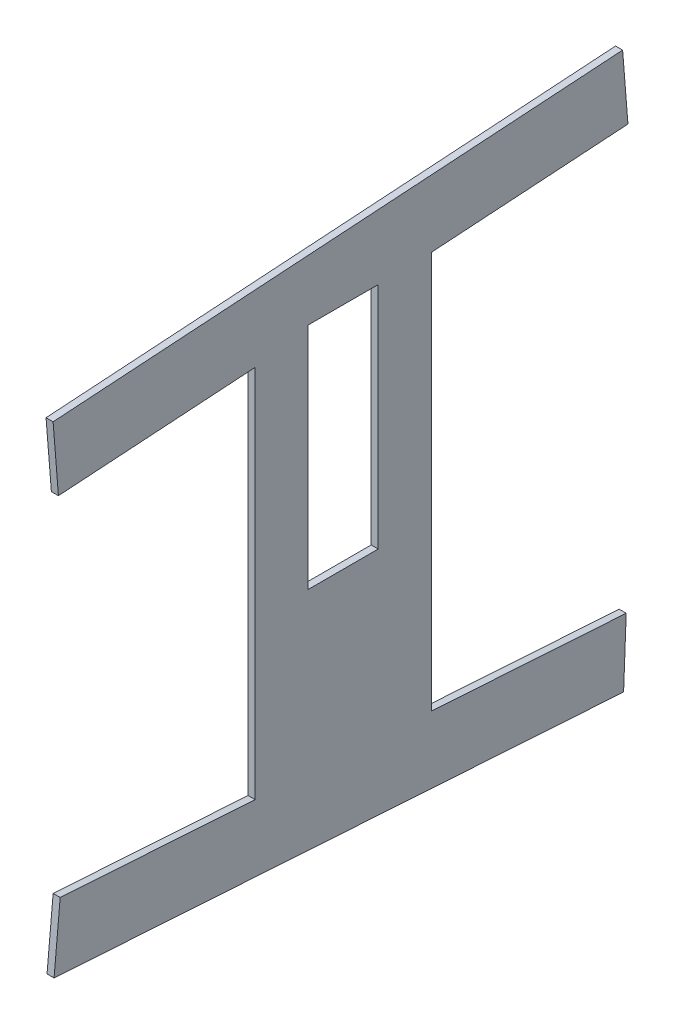
ISO-10303-21;
HEADER;
FILE_DESCRIPTION(('STEP AP214'),'2;1');
FILE_NAME('part.step','',(''),(''),'','','');
FILE_SCHEMA(('AUTOMOTIVE_DESIGN { 1 0 10303 214 1 1 1 1 }'));
ENDSEC;
DATA;
#1=APPLICATION_CONTEXT('core data for automotive mechanical design processes');
#2=APPLICATION_PROTOCOL_DEFINITION('international standard','automotive_design',2000,#1);
#3=PRODUCT_CONTEXT('',#1,'mechanical');
#4=PRODUCT('Part','Part','',(#3));
#5=PRODUCT_RELATED_PRODUCT_CATEGORY('part','',(#4));
#6=PRODUCT_DEFINITION_FORMATION('','',#4);
#7=PRODUCT_DEFINITION_CONTEXT('part definition',#1,'design');
#8=PRODUCT_DEFINITION('design','',#6,#7);
#9=PRODUCT_DEFINITION_SHAPE('','',#8);
#10=(LENGTH_UNIT() NAMED_UNIT(*) SI_UNIT(.MILLI.,.METRE.));
#11=(NAMED_UNIT(*) PLANE_ANGLE_UNIT() SI_UNIT($,.RADIAN.));
#12=(NAMED_UNIT(*) SI_UNIT($,.STERADIAN.) SOLID_ANGLE_UNIT());
#13=UNCERTAINTY_MEASURE_WITH_UNIT(LENGTH_MEASURE(1.E-05),#10,'distance_accuracy_value','');
#14=(GEOMETRIC_REPRESENTATION_CONTEXT(3) GLOBAL_UNCERTAINTY_ASSIGNED_CONTEXT((#13)) GLOBAL_UNIT_ASSIGNED_CONTEXT((#10,
#11,#12)) REPRESENTATION_CONTEXT('',''));
#15=CARTESIAN_POINT('',(0.,0.,0.));
#16=DIRECTION('',(0.,0.,1.));
#17=DIRECTION('',(1.,0.,0.));
#18=AXIS2_PLACEMENT_3D('',#15,#16,#17);
#19=CARTESIAN_POINT('',(2.,-49.5204372760135,78.8174325640613));
#20=DIRECTION('',(0.,-0.997886860933081,0.0649754782754394));
#21=DIRECTION('',(0.,-0.0649754782754394,-0.997886860933081));
#22=AXIS2_PLACEMENT_3D('',#19,#20,#21);
#23=PLANE('',#22);
#24=DIRECTION('',(0.,0.0649754782754394,0.997886860933081));
#25=VECTOR('',#24,1.);
#26=CARTESIAN_POINT('',(0.,-49.5204372760135,78.8174325640613));
#27=LINE('',#26,#25);
#28=CARTESIAN_POINT('',(0.,-53.1231711456616,23.4870081119276));
#29=VERTEX_POINT('',#28);
#30=CARTESIAN_POINT('',(0.,-49.5204372760135,78.8174325640613));
#31=VERTEX_POINT('',#30);
#32=EDGE_CURVE('E195',#29,#31,#27,.T.);
#33=ORIENTED_EDGE('',*,*,#32,.T.);
#34=DIRECTION('',(-1.,0.,0.));
#35=VECTOR('',#34,1.);
#36=CARTESIAN_POINT('',(2.,-49.5204372760135,78.8174325640613));
#37=LINE('',#36,#35);
#38=CARTESIAN_POINT('',(2.,-49.5204372760135,78.8174325640613));
#39=VERTEX_POINT('',#38);
#40=EDGE_CURVE('E11',#39,#31,#37,.T.);
#41=ORIENTED_EDGE('',*,*,#40,.F.);
#42=DIRECTION('',(0.,0.0649754782754394,0.997886860933081));
#43=VECTOR('',#42,1.);
#44=CARTESIAN_POINT('',(2.,-49.5204372760135,78.8174325640613));
#45=LINE('',#44,#43);
#46=CARTESIAN_POINT('',(2.,-53.1231711456616,23.4870081119276));
#47=VERTEX_POINT('',#46);
#48=EDGE_CURVE('E201',#47,#39,#45,.T.);
#49=ORIENTED_EDGE('',*,*,#48,.F.);
#50=DIRECTION('',(-1.,0.,0.));
#51=VECTOR('',#50,1.);
#52=CARTESIAN_POINT('',(2.,-53.1231711456616,23.4870081119276));
#53=LINE('',#52,#51);
#54=EDGE_CURVE('E239',#47,#29,#53,.T.);
#55=ORIENTED_EDGE('',*,*,#54,.T.);
#56=EDGE_LOOP('',(#33,#41,#49,#55));
#57=FACE_BOUND('',#56,.T.);
#58=ADVANCED_FACE('F39',(#57),#23,.F.);
#59=CARTESIAN_POINT('',(2.,-68.4478345443312,80.5503779347406));
#60=DIRECTION('',(0.,-0.0911761531463019,-0.99583478001998));
#61=DIRECTION('',(0.,0.99583478001998,-0.0911761531463019));
#62=AXIS2_PLACEMENT_3D('',#59,#60,#61);
#63=PLANE('',#62);
#64=DIRECTION('',(0.,-0.99583478001998,0.0911761531463019));
#65=VECTOR('',#64,1.);
#66=CARTESIAN_POINT('',(0.,-68.4478345443312,80.5503779347406));
#67=LINE('',#66,#65);
#68=CARTESIAN_POINT('',(0.,-68.4478345443312,80.5503779347406));
#69=VERTEX_POINT('',#68);
#70=EDGE_CURVE('E243',#31,#69,#67,.T.);
#71=ORIENTED_EDGE('',*,*,#70,.T.);
#72=DIRECTION('',(-1.,0.,0.));
#73=VECTOR('',#72,1.);
#74=CARTESIAN_POINT('',(2.,-68.4478345443312,80.5503779347406));
#75=LINE('',#74,#73);
#76=CARTESIAN_POINT('',(2.,-68.4478345443312,80.5503779347406));
#77=VERTEX_POINT('',#76);
#78=EDGE_CURVE('E47',#77,#69,#75,.T.);
#79=ORIENTED_EDGE('',*,*,#78,.F.);
#80=DIRECTION('',(0.,-0.99583478001998,0.0911761531463019));
#81=VECTOR('',#80,1.);
#82=CARTESIAN_POINT('',(2.,-68.4478345443312,80.5503779347406));
#83=LINE('',#82,#81);
#84=EDGE_CURVE('E205',#39,#77,#83,.T.);
#85=ORIENTED_EDGE('',*,*,#84,.F.);
#86=ORIENTED_EDGE('',*,*,#40,.T.);
#87=EDGE_LOOP('',(#71,#79,#85,#86));
#88=FACE_BOUND('',#87,.T.);
#89=ADVANCED_FACE('F340',(#88),#63,.F.);
#90=CARTESIAN_POINT('',(2.,-78.9738620249524,-81.1072935364186));
#91=DIRECTION('',(0.,0.997886860933081,-0.0649754782754395));
#92=DIRECTION('',(0.,0.0649754782754395,0.997886860933081));
#93=AXIS2_PLACEMENT_3D('',#90,#91,#92);
#94=PLANE('',#93);
#95=DIRECTION('',(0.,-0.0649754782754395,-0.997886860933081));
#96=VECTOR('',#95,1.);
#97=CARTESIAN_POINT('',(0.,-78.9738620249524,-81.1072935364186));
#98=LINE('',#97,#96);
#99=CARTESIAN_POINT('',(0.,-78.9738620249524,-81.1072935364186));
#100=VERTEX_POINT('',#99);
#101=EDGE_CURVE('E246',#69,#100,#98,.T.);
#102=ORIENTED_EDGE('',*,*,#101,.T.);
#103=DIRECTION('',(-1.,0.,0.));
#104=VECTOR('',#103,1.);
#105=CARTESIAN_POINT('',(2.,-78.9738620249524,-81.1072935364186));
#106=LINE('',#105,#104);
#107=CARTESIAN_POINT('',(2.,-78.9738620249524,-81.1072935364186));
#108=VERTEX_POINT('',#107);
#109=EDGE_CURVE('E310',#108,#100,#106,.T.);
#110=ORIENTED_EDGE('',*,*,#109,.F.);
#111=DIRECTION('',(0.,-0.0649754782754395,-0.997886860933081));
#112=VECTOR('',#111,1.);
#113=CARTESIAN_POINT('',(2.,-78.9738620249524,-81.1072935364186));
#114=LINE('',#113,#112);
#115=EDGE_CURVE('E209',#77,#108,#114,.T.);
#116=ORIENTED_EDGE('',*,*,#115,.F.);
#117=ORIENTED_EDGE('',*,*,#78,.T.);
#118=EDGE_LOOP('',(#102,#110,#116,#117));
#119=FACE_BOUND('',#118,.T.);
#120=ADVANCED_FACE('F319',(#119),#94,.F.);
#121=CARTESIAN_POINT('',(2.,-59.981558577813,-81.8434163402061));
#122=DIRECTION('',(0.,0.0387299257254191,0.999249714962833));
#123=DIRECTION('',(0.,-0.999249714962833,0.0387299257254191));
#124=AXIS2_PLACEMENT_3D('',#121,#122,#123);
#125=PLANE('',#124);
#126=DIRECTION('',(0.,0.999249714962833,-0.0387299257254191));
#127=VECTOR('',#126,1.);
#128=CARTESIAN_POINT('',(0.,-59.981558577813,-81.8434163402061));
#129=LINE('',#128,#127);
#130=CARTESIAN_POINT('',(0.,-59.981558577813,-81.8434163402061));
#131=VERTEX_POINT('',#130);
#132=EDGE_CURVE('E249',#100,#131,#129,.T.);
#133=ORIENTED_EDGE('',*,*,#132,.T.);
#134=DIRECTION('',(-1.,0.,0.));
#135=VECTOR('',#134,1.);
#136=CARTESIAN_POINT('',(2.,-59.981558577813,-81.8434163402061));
#137=LINE('',#136,#135);
#138=CARTESIAN_POINT('',(2.,-59.981558577813,-81.8434163402061));
#139=VERTEX_POINT('',#138);
#140=EDGE_CURVE('E306',#139,#131,#137,.T.);
#141=ORIENTED_EDGE('',*,*,#140,.F.);
#142=DIRECTION('',(0.,0.999249714962833,-0.0387299257254191));
#143=VECTOR('',#142,1.);
#144=CARTESIAN_POINT('',(2.,-59.981558577813,-81.8434163402061));
#145=LINE('',#144,#143);
#146=EDGE_CURVE('E212',#108,#139,#145,.T.);
#147=ORIENTED_EDGE('',*,*,#146,.F.);
#148=ORIENTED_EDGE('',*,*,#109,.T.);
#149=EDGE_LOOP('',(#133,#141,#147,#148));
#150=FACE_BOUND('',#149,.T.);
#151=ADVANCED_FACE('F328',(#150),#125,.F.);
#152=CARTESIAN_POINT('',(2.,-56.3788247081649,-26.5129918880724));
#153=DIRECTION('',(0.,-0.997886860933081,0.0649754782754394));
#154=DIRECTION('',(0.,-0.0649754782754394,-0.997886860933081));
#155=AXIS2_PLACEMENT_3D('',#152,#153,#154);
#156=PLANE('',#155);
#157=DIRECTION('',(0.,0.0649754782754394,0.997886860933081));
#158=VECTOR('',#157,1.);
#159=CARTESIAN_POINT('',(0.,-56.3788247081649,-26.5129918880724));
#160=LINE('',#159,#158);
#161=CARTESIAN_POINT('',(0.,-56.3788247081649,-26.5129918880724));
#162=VERTEX_POINT('',#161);
#163=EDGE_CURVE('E252',#131,#162,#160,.T.);
#164=ORIENTED_EDGE('',*,*,#163,.T.);
#165=DIRECTION('',(-1.,0.,0.));
#166=VECTOR('',#165,1.);
#167=CARTESIAN_POINT('',(2.,-56.3788247081649,-26.5129918880724));
#168=LINE('',#167,#166);
#169=CARTESIAN_POINT('',(2.,-56.3788247081649,-26.5129918880724));
#170=VERTEX_POINT('',#169);
#171=EDGE_CURVE('E302',#170,#162,#168,.T.);
#172=ORIENTED_EDGE('',*,*,#171,.F.);
#173=DIRECTION('',(0.,0.0649754782754394,0.997886860933081));
#174=VECTOR('',#173,1.);
#175=CARTESIAN_POINT('',(2.,-56.3788247081649,-26.5129918880724));
#176=LINE('',#175,#174);
#177=EDGE_CURVE('E215',#139,#170,#176,.T.);
#178=ORIENTED_EDGE('',*,*,#177,.F.);
#179=ORIENTED_EDGE('',*,*,#140,.T.);
#180=EDGE_LOOP('',(#164,#172,#178,#179));
#181=FACE_BOUND('',#180,.T.);
#182=ADVANCED_FACE('F332',(#181),#156,.F.);
#183=CARTESIAN_POINT('',(2.,56.3788247081649,-26.5129918880724));
#184=DIRECTION('',(0.,0.,1.));
#185=DIRECTION('',(1.,0.,0.));
#186=AXIS2_PLACEMENT_3D('',#183,#184,#185);
#187=PLANE('',#186);
#188=DIRECTION('',(0.,1.,0.));
#189=VECTOR('',#188,1.);
#190=CARTESIAN_POINT('',(0.,56.3788247081649,-26.5129918880724));
#191=LINE('',#190,#189);
#192=CARTESIAN_POINT('',(0.,56.3788247081649,-26.5129918880724));
#193=VERTEX_POINT('',#192);
#194=EDGE_CURVE('E255',#162,#193,#191,.T.);
#195=ORIENTED_EDGE('',*,*,#194,.T.);
#196=DIRECTION('',(-1.,0.,0.));
#197=VECTOR('',#196,1.);
#198=CARTESIAN_POINT('',(2.,56.3788247081649,-26.5129918880724));
#199=LINE('',#198,#197);
#200=CARTESIAN_POINT('',(2.,56.3788247081649,-26.5129918880724));
#201=VERTEX_POINT('',#200);
#202=EDGE_CURVE('E298',#201,#193,#199,.T.);
#203=ORIENTED_EDGE('',*,*,#202,.F.);
#204=DIRECTION('',(0.,1.,0.));
#205=VECTOR('',#204,1.);
#206=CARTESIAN_POINT('',(2.,56.3788247081649,-26.5129918880724));
#207=LINE('',#206,#205);
#208=EDGE_CURVE('E218',#170,#201,#207,.T.);
#209=ORIENTED_EDGE('',*,*,#208,.F.);
#210=ORIENTED_EDGE('',*,*,#171,.T.);
#211=EDGE_LOOP('',(#195,#203,#209,#210));
#212=FACE_BOUND('',#211,.T.);
#213=ADVANCED_FACE('F373',(#212),#187,.F.);
#214=CARTESIAN_POINT('',(2.,60.018441422187,-82.3414089760381));
#215=DIRECTION('',(0.,0.997881692444022,0.0650548067790153));
#216=DIRECTION('',(0.,-0.0650548067790154,0.997881692444022));
#217=AXIS2_PLACEMENT_3D('',#214,#215,#216);
#218=PLANE('',#217);
#219=DIRECTION('',(0.,0.0650548067790154,-0.997881692444022));
#220=VECTOR('',#219,1.);
#221=CARTESIAN_POINT('',(0.,60.018441422187,-82.3414089760381));
#222=LINE('',#221,#220);
#223=CARTESIAN_POINT('',(0.,60.018441422187,-82.3414089760381));
#224=VERTEX_POINT('',#223);
#225=EDGE_CURVE('E258',#193,#224,#222,.T.);
#226=ORIENTED_EDGE('',*,*,#225,.T.);
#227=DIRECTION('',(-1.,0.,0.));
#228=VECTOR('',#227,1.);
#229=CARTESIAN_POINT('',(2.,60.018441422187,-82.3414089760381));
#230=LINE('',#229,#228);
#231=CARTESIAN_POINT('',(2.,60.018441422187,-82.3414089760381));
#232=VERTEX_POINT('',#231);
#233=EDGE_CURVE('E294',#232,#224,#230,.T.);
#234=ORIENTED_EDGE('',*,*,#233,.F.);
#235=DIRECTION('',(0.,0.0650548067790154,-0.997881692444022));
#236=VECTOR('',#235,1.);
#237=CARTESIAN_POINT('',(2.,60.018441422187,-82.3414089760381));
#238=LINE('',#237,#236);
#239=EDGE_CURVE('E221',#201,#232,#238,.T.);
#240=ORIENTED_EDGE('',*,*,#239,.F.);
#241=ORIENTED_EDGE('',*,*,#202,.T.);
#242=EDGE_LOOP('',(#226,#234,#240,#241));
#243=FACE_BOUND('',#242,.T.);
#244=ADVANCED_FACE('F371',(#243),#218,.F.);
#245=CARTESIAN_POINT('',(2.,78.9601383670115,-80.8284170879658));
#246=DIRECTION('',(0.,-0.0796226577997323,0.996825076111605));
#247=DIRECTION('',(0.,-0.996825076111605,-0.0796226577997323));
#248=AXIS2_PLACEMENT_3D('',#245,#246,#247);
#249=PLANE('',#248);
#250=DIRECTION('',(0.,0.996825076111605,0.0796226577997323));
#251=VECTOR('',#250,1.);
#252=CARTESIAN_POINT('',(0.,78.9601383670115,-80.8284170879658));
#253=LINE('',#252,#251);
#254=CARTESIAN_POINT('',(0.,78.9601383670115,-80.8284170879658));
#255=VERTEX_POINT('',#254);
#256=EDGE_CURVE('E261',#224,#255,#253,.T.);
#257=ORIENTED_EDGE('',*,*,#256,.T.);
#258=DIRECTION('',(-1.,0.,0.));
#259=VECTOR('',#258,1.);
#260=CARTESIAN_POINT('',(2.,78.9601383670115,-80.8284170879658));
#261=LINE('',#260,#259);
#262=CARTESIAN_POINT('',(2.,78.9601383670115,-80.8284170879658));
#263=VERTEX_POINT('',#262);
#264=EDGE_CURVE('E290',#263,#255,#261,.T.);
#265=ORIENTED_EDGE('',*,*,#264,.F.);
#266=DIRECTION('',(0.,0.996825076111605,0.0796226577997323));
#267=VECTOR('',#266,1.);
#268=CARTESIAN_POINT('',(2.,78.9601383670115,-80.8284170879658));
#269=LINE('',#268,#267);
#270=EDGE_CURVE('E224',#232,#263,#269,.T.);
#271=ORIENTED_EDGE('',*,*,#270,.F.);
#272=ORIENTED_EDGE('',*,*,#233,.T.);
#273=EDGE_LOOP('',(#257,#265,#271,#272));
#274=FACE_BOUND('',#273,.T.);
#275=ADVANCED_FACE('F367',(#274),#249,.F.);
#276=CARTESIAN_POINT('',(2.,68.421259668811,80.8284170879658));
#277=DIRECTION('',(0.,-0.997881692444022,-0.0650548067790154));
#278=DIRECTION('',(0.,0.0650548067790154,-0.997881692444022));
#279=AXIS2_PLACEMENT_3D('',#276,#277,#278);
#280=PLANE('',#279);
#281=DIRECTION('',(0.,-0.0650548067790154,0.997881692444022));
#282=VECTOR('',#281,1.);
#283=CARTESIAN_POINT('',(0.,68.421259668811,80.8284170879658));
#284=LINE('',#283,#282);
#285=CARTESIAN_POINT('',(0.,68.421259668811,80.8284170879658));
#286=VERTEX_POINT('',#285);
#287=EDGE_CURVE('E264',#255,#286,#284,.T.);
#288=ORIENTED_EDGE('',*,*,#287,.T.);
#289=DIRECTION('',(-1.,0.,0.));
#290=VECTOR('',#289,1.);
#291=CARTESIAN_POINT('',(2.,68.421259668811,80.8284170879658));
#292=LINE('',#291,#290);
#293=CARTESIAN_POINT('',(2.,68.421259668811,80.8284170879658));
#294=VERTEX_POINT('',#293);
#295=EDGE_CURVE('E286',#294,#286,#292,.T.);
#296=ORIENTED_EDGE('',*,*,#295,.F.);
#297=DIRECTION('',(0.,-0.0650548067790154,0.997881692444022));
#298=VECTOR('',#297,1.);
#299=CARTESIAN_POINT('',(2.,68.421259668811,80.8284170879658));
#300=LINE('',#299,#298);
#301=EDGE_CURVE('E227',#263,#294,#300,.T.);
#302=ORIENTED_EDGE('',*,*,#301,.F.);
#303=ORIENTED_EDGE('',*,*,#264,.T.);
#304=EDGE_LOOP('',(#288,#296,#302,#303));
#305=FACE_BOUND('',#304,.T.);
#306=ADVANCED_FACE('F362',(#305),#280,.F.);
#307=CARTESIAN_POINT('',(2.,49.4795627239865,79.3154251998934));
#308=DIRECTION('',(0.,0.079622657799733,-0.996825076111605));
#309=DIRECTION('',(0.,0.996825076111605,0.079622657799733));
#310=AXIS2_PLACEMENT_3D('',#307,#308,#309);
#311=PLANE('',#310);
#312=DIRECTION('',(0.,-0.996825076111605,-0.079622657799733));
#313=VECTOR('',#312,1.);
#314=CARTESIAN_POINT('',(0.,49.4795627239865,79.3154251998934));
#315=LINE('',#314,#313);
#316=CARTESIAN_POINT('',(0.,49.4795627239865,79.3154251998934));
#317=VERTEX_POINT('',#316);
#318=EDGE_CURVE('E267',#286,#317,#315,.T.);
#319=ORIENTED_EDGE('',*,*,#318,.T.);
#320=DIRECTION('',(-1.,0.,0.));
#321=VECTOR('',#320,1.);
#322=CARTESIAN_POINT('',(2.,49.4795627239865,79.3154251998934));
#323=LINE('',#322,#321);
#324=CARTESIAN_POINT('',(2.,49.4795627239865,79.3154251998934));
#325=VERTEX_POINT('',#324);
#326=EDGE_CURVE('E282',#325,#317,#323,.T.);
#327=ORIENTED_EDGE('',*,*,#326,.F.);
#328=DIRECTION('',(0.,-0.996825076111605,-0.079622657799733));
#329=VECTOR('',#328,1.);
#330=CARTESIAN_POINT('',(2.,49.4795627239865,79.3154251998934));
#331=LINE('',#330,#329);
#332=EDGE_CURVE('E230',#294,#325,#331,.T.);
#333=ORIENTED_EDGE('',*,*,#332,.F.);
#334=ORIENTED_EDGE('',*,*,#295,.T.);
#335=EDGE_LOOP('',(#319,#327,#333,#334));
#336=FACE_BOUND('',#335,.T.);
#337=ADVANCED_FACE('F356',(#336),#311,.F.);
#338=CARTESIAN_POINT('',(2.,53.1191794380086,23.4870081119276));
#339=DIRECTION('',(0.,0.997881692444022,0.0650548067790153));
#340=DIRECTION('',(0.,-0.0650548067790154,0.997881692444022));
#341=AXIS2_PLACEMENT_3D('',#338,#339,#340);
#342=PLANE('',#341);
#343=DIRECTION('',(0.,0.0650548067790154,-0.997881692444022));
#344=VECTOR('',#343,1.);
#345=CARTESIAN_POINT('',(0.,53.1191794380086,23.4870081119276));
#346=LINE('',#345,#344);
#347=CARTESIAN_POINT('',(0.,53.1191794380086,23.4870081119276));
#348=VERTEX_POINT('',#347);
#349=EDGE_CURVE('E270',#317,#348,#346,.T.);
#350=ORIENTED_EDGE('',*,*,#349,.T.);
#351=DIRECTION('',(-1.,0.,0.));
#352=VECTOR('',#351,1.);
#353=CARTESIAN_POINT('',(2.,53.1191794380086,23.4870081119276));
#354=LINE('',#353,#352);
#355=CARTESIAN_POINT('',(2.,53.1191794380086,23.4870081119276));
#356=VERTEX_POINT('',#355);
#357=EDGE_CURVE('E278',#356,#348,#354,.T.);
#358=ORIENTED_EDGE('',*,*,#357,.F.);
#359=DIRECTION('',(0.,0.0650548067790154,-0.997881692444022));
#360=VECTOR('',#359,1.);
#361=CARTESIAN_POINT('',(2.,53.1191794380086,23.4870081119276));
#362=LINE('',#361,#360);
#363=EDGE_CURVE('E233',#325,#356,#362,.T.);
#364=ORIENTED_EDGE('',*,*,#363,.F.);
#365=ORIENTED_EDGE('',*,*,#326,.T.);
#366=EDGE_LOOP('',(#350,#358,#364,#365));
#367=FACE_BOUND('',#366,.T.);
#368=ADVANCED_FACE('F352',(#367),#342,.F.);
#369=CARTESIAN_POINT('',(2.,-53.1231711456616,23.4870081119276));
#370=DIRECTION('',(0.,0.,-1.));
#371=DIRECTION('',(-1.,0.,0.));
#372=AXIS2_PLACEMENT_3D('',#369,#370,#371);
#373=PLANE('',#372);
#374=DIRECTION('',(0.,-1.,0.));
#375=VECTOR('',#374,1.);
#376=CARTESIAN_POINT('',(0.,-53.1231711456616,23.4870081119276));
#377=LINE('',#376,#375);
#378=EDGE_CURVE('E206',#348,#29,#377,.T.);
#379=ORIENTED_EDGE('',*,*,#378,.T.);
#380=ORIENTED_EDGE('',*,*,#54,.F.);
#381=DIRECTION('',(0.,-1.,0.));
#382=VECTOR('',#381,1.);
#383=CARTESIAN_POINT('',(2.,-53.1231711456616,23.4870081119276));
#384=LINE('',#383,#382);
#385=EDGE_CURVE('E236',#356,#47,#384,.T.);
#386=ORIENTED_EDGE('',*,*,#385,.F.);
#387=ORIENTED_EDGE('',*,*,#357,.T.);
#388=EDGE_LOOP('',(#379,#380,#386,#387));
#389=FACE_BOUND('',#388,.T.);
#390=ADVANCED_FACE('F347',(#389),#373,.F.);
#391=CARTESIAN_POINT('',(2.,0.,0.));
#392=DIRECTION('',(-1.,0.,0.));
#393=DIRECTION('',(0.,0.,1.));
#394=AXIS2_PLACEMENT_3D('',#391,#392,#393);
#395=PLANE('',#394);
#396=DIRECTION('',(0.,0.,1.));
#397=VECTOR('',#396,1.);
#398=CARTESIAN_POINT('',(2.,56.0008191885134,8.53827697011346));
#399=LINE('',#398,#397);
#400=CARTESIAN_POINT('',(2.,56.0008191885134,-11.4617230298865));
#401=VERTEX_POINT('',#400);
#402=CARTESIAN_POINT('',(2.,56.0008191885134,8.53827697011346));
#403=VERTEX_POINT('',#402);
#404=EDGE_CURVE('E186',#401,#403,#399,.T.);
#405=ORIENTED_EDGE('',*,*,#404,.F.);
#406=DIRECTION('',(0.,1.,0.));
#407=VECTOR('',#406,1.);
#408=CARTESIAN_POINT('',(2.,56.0008191885134,-11.4617230298865));
#409=LINE('',#408,#407);
#410=CARTESIAN_POINT('',(2.,-8.99918081148656,-11.4617230298865));
#411=VERTEX_POINT('',#410);
#412=EDGE_CURVE('E54',#411,#401,#409,.T.);
#413=ORIENTED_EDGE('',*,*,#412,.F.);
#414=DIRECTION('',(0.,0.,-1.));
#415=VECTOR('',#414,1.);
#416=CARTESIAN_POINT('',(2.,-8.99918081148656,8.53827697011345));
#417=LINE('',#416,#415);
#418=CARTESIAN_POINT('',(2.,-8.99918081148656,8.53827697011345));
#419=VERTEX_POINT('',#418);
#420=EDGE_CURVE('E173',#419,#411,#417,.T.);
#421=ORIENTED_EDGE('',*,*,#420,.F.);
#422=DIRECTION('',(0.,-1.,0.));
#423=VECTOR('',#422,1.);
#424=CARTESIAN_POINT('',(2.,56.0008191885134,8.53827697011346));
#425=LINE('',#424,#423);
#426=EDGE_CURVE('E177',#403,#419,#425,.T.);
#427=ORIENTED_EDGE('',*,*,#426,.F.);
#428=EDGE_LOOP('',(#405,#413,#421,#427));
#429=FACE_BOUND('',#428,.T.);
#430=ORIENTED_EDGE('',*,*,#48,.T.);
#431=ORIENTED_EDGE('',*,*,#84,.T.);
#432=ORIENTED_EDGE('',*,*,#115,.T.);
#433=ORIENTED_EDGE('',*,*,#146,.T.);
#434=ORIENTED_EDGE('',*,*,#177,.T.);
#435=ORIENTED_EDGE('',*,*,#208,.T.);
#436=ORIENTED_EDGE('',*,*,#239,.T.);
#437=ORIENTED_EDGE('',*,*,#270,.T.);
#438=ORIENTED_EDGE('',*,*,#301,.T.);
#439=ORIENTED_EDGE('',*,*,#332,.T.);
#440=ORIENTED_EDGE('',*,*,#363,.T.);
#441=ORIENTED_EDGE('',*,*,#385,.T.);
#442=EDGE_LOOP('',(#430,#431,#432,#433,#434,#435,#436,#437,#438,#439,#440,#441));
#443=FACE_BOUND('',#442,.T.);
#444=ADVANCED_FACE('F336',(#429,#443),#395,.F.);
#445=CARTESIAN_POINT('',(0.,0.,0.));
#446=DIRECTION('',(-1.,0.,0.));
#447=DIRECTION('',(0.,0.,1.));
#448=AXIS2_PLACEMENT_3D('',#445,#446,#447);
#449=PLANE('',#448);
#450=DIRECTION('',(0.,1.,0.));
#451=VECTOR('',#450,1.);
#452=CARTESIAN_POINT('',(0.,56.0008191885134,-11.4617230298865));
#453=LINE('',#452,#451);
#454=CARTESIAN_POINT('',(0.,-8.99918081148656,-11.4617230298865));
#455=VERTEX_POINT('',#454);
#456=CARTESIAN_POINT('',(0.,56.0008191885134,-11.4617230298865));
#457=VERTEX_POINT('',#456);
#458=EDGE_CURVE('E154',#455,#457,#453,.T.);
#459=ORIENTED_EDGE('',*,*,#458,.T.);
#460=DIRECTION('',(0.,0.,1.));
#461=VECTOR('',#460,1.);
#462=CARTESIAN_POINT('',(0.,56.0008191885134,8.53827697011346));
#463=LINE('',#462,#461);
#464=CARTESIAN_POINT('',(0.,56.0008191885134,8.53827697011346));
#465=VERTEX_POINT('',#464);
#466=EDGE_CURVE('E164',#457,#465,#463,.T.);
#467=ORIENTED_EDGE('',*,*,#466,.T.);
#468=DIRECTION('',(0.,-1.,0.));
#469=VECTOR('',#468,1.);
#470=CARTESIAN_POINT('',(0.,56.0008191885134,8.53827697011346));
#471=LINE('',#470,#469);
#472=CARTESIAN_POINT('',(0.,-8.99918081148656,8.53827697011345));
#473=VERTEX_POINT('',#472);
#474=EDGE_CURVE('E62',#465,#473,#471,.T.);
#475=ORIENTED_EDGE('',*,*,#474,.T.);
#476=DIRECTION('',(0.,0.,-1.));
#477=VECTOR('',#476,1.);
#478=CARTESIAN_POINT('',(0.,-8.99918081148656,8.53827697011345));
#479=LINE('',#478,#477);
#480=EDGE_CURVE('E161',#473,#455,#479,.T.);
#481=ORIENTED_EDGE('',*,*,#480,.T.);
#482=EDGE_LOOP('',(#459,#467,#475,#481));
#483=FACE_BOUND('',#482,.T.);
#484=ORIENTED_EDGE('',*,*,#32,.F.);
#485=ORIENTED_EDGE('',*,*,#378,.F.);
#486=ORIENTED_EDGE('',*,*,#349,.F.);
#487=ORIENTED_EDGE('',*,*,#318,.F.);
#488=ORIENTED_EDGE('',*,*,#287,.F.);
#489=ORIENTED_EDGE('',*,*,#256,.F.);
#490=ORIENTED_EDGE('',*,*,#225,.F.);
#491=ORIENTED_EDGE('',*,*,#194,.F.);
#492=ORIENTED_EDGE('',*,*,#163,.F.);
#493=ORIENTED_EDGE('',*,*,#132,.F.);
#494=ORIENTED_EDGE('',*,*,#101,.F.);
#495=ORIENTED_EDGE('',*,*,#70,.F.);
#496=EDGE_LOOP('',(#484,#485,#486,#487,#488,#489,#490,#491,#492,#493,#494,#495));
#497=FACE_BOUND('',#496,.T.);
#498=ADVANCED_FACE('F169',(#483,#497),#449,.T.);
#499=CARTESIAN_POINT('',(0.,56.0008191885134,-11.4617230298865));
#500=DIRECTION('',(0.,0.,-1.));
#501=DIRECTION('',(0.,1.,0.));
#502=AXIS2_PLACEMENT_3D('',#499,#500,#501);
#503=PLANE('',#502);
#504=ORIENTED_EDGE('',*,*,#412,.T.);
#505=DIRECTION('',(1.,0.,0.));
#506=VECTOR('',#505,1.);
#507=CARTESIAN_POINT('',(0.,56.0008191885134,-11.4617230298865));
#508=LINE('',#507,#506);
#509=EDGE_CURVE('E150',#457,#401,#508,.T.);
#510=ORIENTED_EDGE('',*,*,#509,.F.);
#511=ORIENTED_EDGE('',*,*,#458,.F.);
#512=DIRECTION('',(1.,0.,0.));
#513=VECTOR('',#512,1.);
#514=CARTESIAN_POINT('',(0.,-8.99918081148656,-11.4617230298865));
#515=LINE('',#514,#513);
#516=EDGE_CURVE('E192',#455,#411,#515,.T.);
#517=ORIENTED_EDGE('',*,*,#516,.T.);
#518=EDGE_LOOP('',(#504,#510,#511,#517));
#519=FACE_BOUND('',#518,.T.);
#520=ADVANCED_FACE('F152',(#519),#503,.F.);
#521=CARTESIAN_POINT('',(0.,-8.99918081148656,8.53827697011345));
#522=DIRECTION('',(0.,-1.,0.));
#523=DIRECTION('',(0.,0.,-1.));
#524=AXIS2_PLACEMENT_3D('',#521,#522,#523);
#525=PLANE('',#524);
#526=ORIENTED_EDGE('',*,*,#420,.T.);
#527=ORIENTED_EDGE('',*,*,#516,.F.);
#528=ORIENTED_EDGE('',*,*,#480,.F.);
#529=DIRECTION('',(1.,0.,0.));
#530=VECTOR('',#529,1.);
#531=CARTESIAN_POINT('',(0.,-8.99918081148656,8.53827697011345));
#532=LINE('',#531,#530);
#533=EDGE_CURVE('E196',#473,#419,#532,.T.);
#534=ORIENTED_EDGE('',*,*,#533,.T.);
#535=EDGE_LOOP('',(#526,#527,#528,#534));
#536=FACE_BOUND('',#535,.T.);
#537=ADVANCED_FACE('F476',(#536),#525,.F.);
#538=CARTESIAN_POINT('',(0.,56.0008191885134,8.53827697011346));
#539=DIRECTION('',(0.,0.,1.));
#540=DIRECTION('',(0.,-1.,0.));
#541=AXIS2_PLACEMENT_3D('',#538,#539,#540);
#542=PLANE('',#541);
#543=ORIENTED_EDGE('',*,*,#426,.T.);
#544=ORIENTED_EDGE('',*,*,#533,.F.);
#545=ORIENTED_EDGE('',*,*,#474,.F.);
#546=DIRECTION('',(1.,0.,0.));
#547=VECTOR('',#546,1.);
#548=CARTESIAN_POINT('',(0.,56.0008191885134,8.53827697011346));
#549=LINE('',#548,#547);
#550=EDGE_CURVE('E160',#465,#403,#549,.T.);
#551=ORIENTED_EDGE('',*,*,#550,.T.);
#552=EDGE_LOOP('',(#543,#544,#545,#551));
#553=FACE_BOUND('',#552,.T.);
#554=ADVANCED_FACE('F485',(#553),#542,.F.);
#555=CARTESIAN_POINT('',(0.,56.0008191885134,8.53827697011346));
#556=DIRECTION('',(0.,1.,0.));
#557=DIRECTION('',(0.,0.,1.));
#558=AXIS2_PLACEMENT_3D('',#555,#556,#557);
#559=PLANE('',#558);
#560=ORIENTED_EDGE('',*,*,#404,.T.);
#561=ORIENTED_EDGE('',*,*,#550,.F.);
#562=ORIENTED_EDGE('',*,*,#466,.F.);
#563=ORIENTED_EDGE('',*,*,#509,.T.);
#564=EDGE_LOOP('',(#560,#561,#562,#563));
#565=FACE_BOUND('',#564,.T.);
#566=ADVANCED_FACE('F165',(#565),#559,.F.);
#567=CLOSED_SHELL('',(#58,#89,#120,#151,#182,#213,#244,#275,#306,#337,#368,#390,#444,#498,#520,
#537,#554,#566));
#568=MANIFOLD_SOLID_BREP('B2',#567);
#569=ADVANCED_BREP_SHAPE_REPRESENTATION('',(#18,#568),#14);
#570=SHAPE_DEFINITION_REPRESENTATION(#9,#569);
ENDSEC;
END-ISO-10303-21;
